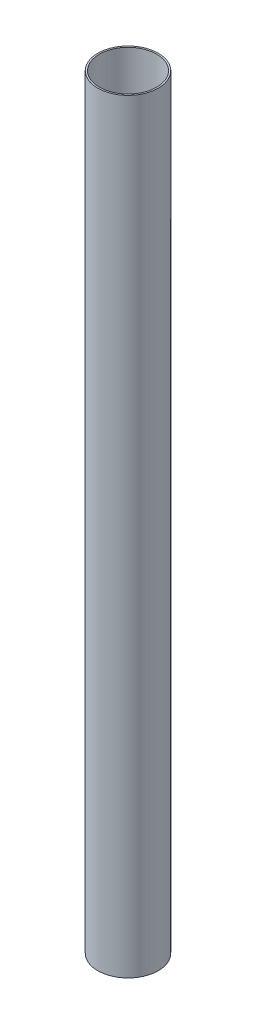
ISO-10303-21;
HEADER;
FILE_DESCRIPTION(('STEP AP214'),'2;1');
FILE_NAME('part.step','',(''),(''),'','','');
FILE_SCHEMA(('AUTOMOTIVE_DESIGN { 1 0 10303 214 1 1 1 1 }'));
ENDSEC;
DATA;
#1=APPLICATION_CONTEXT('core data for automotive mechanical design processes');
#2=APPLICATION_PROTOCOL_DEFINITION('international standard','automotive_design',2000,#1);
#3=PRODUCT_CONTEXT('',#1,'mechanical');
#4=PRODUCT('Part','Part','',(#3));
#5=PRODUCT_RELATED_PRODUCT_CATEGORY('part','',(#4));
#6=PRODUCT_DEFINITION_FORMATION('','',#4);
#7=PRODUCT_DEFINITION_CONTEXT('part definition',#1,'design');
#8=PRODUCT_DEFINITION('design','',#6,#7);
#9=PRODUCT_DEFINITION_SHAPE('','',#8);
#10=(LENGTH_UNIT() NAMED_UNIT(*) SI_UNIT(.MILLI.,.METRE.));
#11=(NAMED_UNIT(*) PLANE_ANGLE_UNIT() SI_UNIT($,.RADIAN.));
#12=(NAMED_UNIT(*) SI_UNIT($,.STERADIAN.) SOLID_ANGLE_UNIT());
#13=UNCERTAINTY_MEASURE_WITH_UNIT(LENGTH_MEASURE(1.E-05),#10,'distance_accuracy_value','');
#14=(GEOMETRIC_REPRESENTATION_CONTEXT(3) GLOBAL_UNCERTAINTY_ASSIGNED_CONTEXT((#13)) GLOBAL_UNIT_ASSIGNED_CONTEXT((#10,
#11,#12)) REPRESENTATION_CONTEXT('',''));
#15=CARTESIAN_POINT('',(0.,0.,0.));
#16=DIRECTION('',(0.,0.,1.));
#17=DIRECTION('',(1.,0.,0.));
#18=AXIS2_PLACEMENT_3D('',#15,#16,#17);
#19=CARTESIAN_POINT('',(0.,1219.2,0.));
#20=DIRECTION('',(0.,1.,0.));
#21=DIRECTION('',(0.,0.,1.));
#22=AXIS2_PLACEMENT_3D('',#19,#20,#21);
#23=PLANE('',#22);
#24=CARTESIAN_POINT('',(0.,1219.2,0.));
#25=DIRECTION('',(0.,1.,0.));
#26=DIRECTION('',(0.,0.,1.));
#27=AXIS2_PLACEMENT_3D('',#24,#25,#26);
#28=CIRCLE('',#27,48.26);
#29=CARTESIAN_POINT('',(0.,1219.2,-48.26));
#30=VERTEX_POINT('',#29);
#31=EDGE_CURVE('E10',#30,#30,#28,.T.);
#32=ORIENTED_EDGE('',*,*,#31,.T.);
#33=EDGE_LOOP('',(#32));
#34=FACE_BOUND('',#33,.T.);
#35=CARTESIAN_POINT('',(0.,1219.2,0.));
#36=DIRECTION('',(0.,1.,0.));
#37=DIRECTION('',(0.,0.,1.));
#38=AXIS2_PLACEMENT_3D('',#35,#36,#37);
#39=CIRCLE('',#38,45.72);
#40=CARTESIAN_POINT('',(0.,1219.2,-45.72));
#41=VERTEX_POINT('',#40);
#42=EDGE_CURVE('E47',#41,#41,#39,.T.);
#43=ORIENTED_EDGE('',*,*,#42,.F.);
#44=EDGE_LOOP('',(#43));
#45=FACE_BOUND('',#44,.T.);
#46=ADVANCED_FACE('F35',(#34,#45),#23,.T.);
#47=CARTESIAN_POINT('',(0.,0.,0.));
#48=DIRECTION('',(0.,1.,0.));
#49=DIRECTION('',(0.,0.,1.));
#50=AXIS2_PLACEMENT_3D('',#47,#48,#49);
#51=PLANE('',#50);
#52=CARTESIAN_POINT('',(0.,0.,0.));
#53=DIRECTION('',(0.,1.,0.));
#54=DIRECTION('',(0.,0.,1.));
#55=AXIS2_PLACEMENT_3D('',#52,#53,#54);
#56=CIRCLE('',#55,48.26);
#57=CARTESIAN_POINT('',(0.,0.,-48.26));
#58=VERTEX_POINT('',#57);
#59=EDGE_CURVE('E39',#58,#58,#56,.T.);
#60=ORIENTED_EDGE('',*,*,#59,.F.);
#61=EDGE_LOOP('',(#60));
#62=FACE_BOUND('',#61,.T.);
#63=CARTESIAN_POINT('',(0.,0.,0.));
#64=DIRECTION('',(0.,1.,0.));
#65=DIRECTION('',(0.,0.,1.));
#66=AXIS2_PLACEMENT_3D('',#63,#64,#65);
#67=CIRCLE('',#66,45.72);
#68=CARTESIAN_POINT('',(0.,0.,-45.72));
#69=VERTEX_POINT('',#68);
#70=EDGE_CURVE('E49',#69,#69,#67,.T.);
#71=ORIENTED_EDGE('',*,*,#70,.T.);
#72=EDGE_LOOP('',(#71));
#73=FACE_BOUND('',#72,.T.);
#74=ADVANCED_FACE('F60',(#62,#73),#51,.F.);
#75=CARTESIAN_POINT('',(0.,1219.2,0.));
#76=DIRECTION('',(0.,-1.,0.));
#77=DIRECTION('',(0.,0.,-1.));
#78=AXIS2_PLACEMENT_3D('',#75,#76,#77);
#79=CYLINDRICAL_SURFACE('',#78,48.26);
#80=CARTESIAN_POINT('',(0.,1219.2,-48.26));
#81=CARTESIAN_POINT('',(0.,1206.5,-48.26));
#82=CARTESIAN_POINT('',(0.,1193.8,-48.26));
#83=CARTESIAN_POINT('',(0.,1168.4,-48.26));
#84=CARTESIAN_POINT('',(0.,1155.7,-48.26));
#85=CARTESIAN_POINT('',(0.,1130.3,-48.26));
#86=CARTESIAN_POINT('',(0.,1117.6,-48.26));
#87=CARTESIAN_POINT('',(0.,1092.2,-48.26));
#88=CARTESIAN_POINT('',(0.,1079.5,-48.26));
#89=CARTESIAN_POINT('',(0.,1054.1,-48.26));
#90=CARTESIAN_POINT('',(0.,1041.4,-48.26));
#91=CARTESIAN_POINT('',(0.,1016.,-48.26));
#92=CARTESIAN_POINT('',(0.,1003.3,-48.26));
#93=CARTESIAN_POINT('',(0.,977.9,-48.26));
#94=CARTESIAN_POINT('',(0.,965.2,-48.26));
#95=CARTESIAN_POINT('',(0.,939.8,-48.26));
#96=CARTESIAN_POINT('',(0.,927.1,-48.26));
#97=CARTESIAN_POINT('',(0.,901.7,-48.26));
#98=CARTESIAN_POINT('',(0.,889.,-48.26));
#99=CARTESIAN_POINT('',(0.,863.6,-48.26));
#100=CARTESIAN_POINT('',(0.,850.9,-48.26));
#101=CARTESIAN_POINT('',(0.,825.5,-48.26));
#102=CARTESIAN_POINT('',(0.,812.8,-48.26));
#103=CARTESIAN_POINT('',(0.,787.4,-48.26));
#104=CARTESIAN_POINT('',(0.,774.7,-48.26));
#105=CARTESIAN_POINT('',(0.,749.3,-48.26));
#106=CARTESIAN_POINT('',(0.,736.6,-48.26));
#107=CARTESIAN_POINT('',(0.,711.2,-48.26));
#108=CARTESIAN_POINT('',(0.,698.5,-48.26));
#109=CARTESIAN_POINT('',(0.,673.1,-48.26));
#110=CARTESIAN_POINT('',(0.,660.4,-48.26));
#111=CARTESIAN_POINT('',(0.,635.,-48.26));
#112=CARTESIAN_POINT('',(0.,622.3,-48.26));
#113=CARTESIAN_POINT('',(0.,596.9,-48.26));
#114=CARTESIAN_POINT('',(0.,584.2,-48.26));
#115=CARTESIAN_POINT('',(0.,558.8,-48.26));
#116=CARTESIAN_POINT('',(0.,546.1,-48.26));
#117=CARTESIAN_POINT('',(0.,520.7,-48.26));
#118=CARTESIAN_POINT('',(0.,508.,-48.26));
#119=CARTESIAN_POINT('',(0.,482.6,-48.26));
#120=CARTESIAN_POINT('',(0.,469.9,-48.26));
#121=CARTESIAN_POINT('',(0.,444.5,-48.26));
#122=CARTESIAN_POINT('',(0.,431.8,-48.26));
#123=CARTESIAN_POINT('',(0.,406.4,-48.26));
#124=CARTESIAN_POINT('',(0.,393.7,-48.26));
#125=CARTESIAN_POINT('',(0.,368.3,-48.26));
#126=CARTESIAN_POINT('',(0.,355.6,-48.26));
#127=CARTESIAN_POINT('',(0.,330.2,-48.26));
#128=CARTESIAN_POINT('',(0.,317.5,-48.26));
#129=CARTESIAN_POINT('',(0.,292.1,-48.26));
#130=CARTESIAN_POINT('',(0.,279.4,-48.26));
#131=CARTESIAN_POINT('',(0.,254.,-48.26));
#132=CARTESIAN_POINT('',(0.,241.3,-48.26));
#133=CARTESIAN_POINT('',(0.,215.9,-48.26));
#134=CARTESIAN_POINT('',(0.,203.2,-48.26));
#135=CARTESIAN_POINT('',(0.,177.8,-48.26));
#136=CARTESIAN_POINT('',(0.,165.1,-48.26));
#137=CARTESIAN_POINT('',(0.,139.7,-48.26));
#138=CARTESIAN_POINT('',(0.,127.,-48.26));
#139=CARTESIAN_POINT('',(0.,101.6,-48.26));
#140=CARTESIAN_POINT('',(0.,88.9,-48.26));
#141=CARTESIAN_POINT('',(0.,63.5,-48.26));
#142=CARTESIAN_POINT('',(0.,50.8,-48.26));
#143=CARTESIAN_POINT('',(0.,25.4,-48.26));
#144=CARTESIAN_POINT('',(0.,12.7,-48.26));
#145=CARTESIAN_POINT('',(0.,0.,-48.26));
#146=B_SPLINE_CURVE_WITH_KNOTS('',3,(#80,#81,#82,#83,#84,#85,#86,#87,#88,#89,#90,#91,#92,#93,
#94,#95,#96,#97,#98,#99,#100,#101,#102,#103,#104,#105,#106,#107,#108,#109,#110,#111,#112,#113,
#114,#115,#116,#117,#118,#119,#120,#121,#122,#123,#124,#125,#126,#127,#128,#129,#130,#131,#132,
#133,#134,#135,#136,#137,#138,#139,#140,#141,#142,#143,#144,#145),.UNSPECIFIED.,.F.,.F.,(4,2,2,
2,2,2,2,2,2,2,2,2,2,2,2,2,2,2,2,2,2,2,2,2,2,2,2,2,2,2,2,2,4),(0.,38.1,76.2,114.3,152.4,190.5,
228.6,266.7,304.8,342.9,381.,419.1,457.2,495.3,533.4,571.5,609.6,647.7,685.8,723.9,762.,800.1,
838.2,876.3,914.4,952.5,990.6,1028.7,1066.8,1104.9,1143.,1181.1,1219.2),.UNSPECIFIED.);
#147=EDGE_CURVE('BSEAM37',#30,#58,#146,.T.);
#148=ORIENTED_EDGE('',*,*,#31,.F.);
#149=ORIENTED_EDGE('',*,*,#59,.T.);
#150=ORIENTED_EDGE('',*,*,#147,.T.);
#151=ORIENTED_EDGE('',*,*,#147,.F.);
#152=EDGE_LOOP('',(#148,#150,#149,#151));
#153=FACE_BOUND('',#152,.T.);
#154=ADVANCED_FACE('F37',(#153),#79,.T.);
#155=CARTESIAN_POINT('',(0.,1219.2,0.));
#156=DIRECTION('',(0.,-1.,0.));
#157=DIRECTION('',(0.,0.,-1.));
#158=AXIS2_PLACEMENT_3D('',#155,#156,#157);
#159=CYLINDRICAL_SURFACE('',#158,45.72);
#160=CARTESIAN_POINT('',(0.,1219.2,-45.72));
#161=CARTESIAN_POINT('',(0.,1206.5,-45.72));
#162=CARTESIAN_POINT('',(0.,1193.8,-45.72));
#163=CARTESIAN_POINT('',(0.,1168.4,-45.72));
#164=CARTESIAN_POINT('',(0.,1155.7,-45.72));
#165=CARTESIAN_POINT('',(0.,1130.3,-45.72));
#166=CARTESIAN_POINT('',(0.,1117.6,-45.72));
#167=CARTESIAN_POINT('',(0.,1092.2,-45.72));
#168=CARTESIAN_POINT('',(0.,1079.5,-45.72));
#169=CARTESIAN_POINT('',(0.,1054.1,-45.72));
#170=CARTESIAN_POINT('',(0.,1041.4,-45.72));
#171=CARTESIAN_POINT('',(0.,1016.,-45.72));
#172=CARTESIAN_POINT('',(0.,1003.3,-45.72));
#173=CARTESIAN_POINT('',(0.,977.9,-45.72));
#174=CARTESIAN_POINT('',(0.,965.2,-45.72));
#175=CARTESIAN_POINT('',(0.,939.8,-45.72));
#176=CARTESIAN_POINT('',(0.,927.1,-45.72));
#177=CARTESIAN_POINT('',(0.,901.7,-45.72));
#178=CARTESIAN_POINT('',(0.,889.,-45.72));
#179=CARTESIAN_POINT('',(0.,863.6,-45.72));
#180=CARTESIAN_POINT('',(0.,850.9,-45.72));
#181=CARTESIAN_POINT('',(0.,825.5,-45.72));
#182=CARTESIAN_POINT('',(0.,812.8,-45.72));
#183=CARTESIAN_POINT('',(0.,787.4,-45.72));
#184=CARTESIAN_POINT('',(0.,774.7,-45.72));
#185=CARTESIAN_POINT('',(0.,749.3,-45.72));
#186=CARTESIAN_POINT('',(0.,736.6,-45.72));
#187=CARTESIAN_POINT('',(0.,711.2,-45.72));
#188=CARTESIAN_POINT('',(0.,698.5,-45.72));
#189=CARTESIAN_POINT('',(0.,673.1,-45.72));
#190=CARTESIAN_POINT('',(0.,660.4,-45.72));
#191=CARTESIAN_POINT('',(0.,635.,-45.72));
#192=CARTESIAN_POINT('',(0.,622.3,-45.72));
#193=CARTESIAN_POINT('',(0.,596.9,-45.72));
#194=CARTESIAN_POINT('',(0.,584.2,-45.72));
#195=CARTESIAN_POINT('',(0.,558.8,-45.72));
#196=CARTESIAN_POINT('',(0.,546.1,-45.72));
#197=CARTESIAN_POINT('',(0.,520.7,-45.72));
#198=CARTESIAN_POINT('',(0.,508.,-45.72));
#199=CARTESIAN_POINT('',(0.,482.6,-45.72));
#200=CARTESIAN_POINT('',(0.,469.9,-45.72));
#201=CARTESIAN_POINT('',(0.,444.5,-45.72));
#202=CARTESIAN_POINT('',(0.,431.8,-45.72));
#203=CARTESIAN_POINT('',(0.,406.4,-45.72));
#204=CARTESIAN_POINT('',(0.,393.7,-45.72));
#205=CARTESIAN_POINT('',(0.,368.3,-45.72));
#206=CARTESIAN_POINT('',(0.,355.6,-45.72));
#207=CARTESIAN_POINT('',(0.,330.2,-45.72));
#208=CARTESIAN_POINT('',(0.,317.5,-45.72));
#209=CARTESIAN_POINT('',(0.,292.1,-45.72));
#210=CARTESIAN_POINT('',(0.,279.4,-45.72));
#211=CARTESIAN_POINT('',(0.,254.,-45.72));
#212=CARTESIAN_POINT('',(0.,241.3,-45.72));
#213=CARTESIAN_POINT('',(0.,215.9,-45.72));
#214=CARTESIAN_POINT('',(0.,203.2,-45.72));
#215=CARTESIAN_POINT('',(0.,177.8,-45.72));
#216=CARTESIAN_POINT('',(0.,165.1,-45.72));
#217=CARTESIAN_POINT('',(0.,139.7,-45.72));
#218=CARTESIAN_POINT('',(0.,127.,-45.72));
#219=CARTESIAN_POINT('',(0.,101.6,-45.72));
#220=CARTESIAN_POINT('',(0.,88.9,-45.72));
#221=CARTESIAN_POINT('',(0.,63.5,-45.72));
#222=CARTESIAN_POINT('',(0.,50.8,-45.72));
#223=CARTESIAN_POINT('',(0.,25.4,-45.72));
#224=CARTESIAN_POINT('',(0.,12.7,-45.72));
#225=CARTESIAN_POINT('',(0.,0.,-45.72));
#226=B_SPLINE_CURVE_WITH_KNOTS('',3,(#160,#161,#162,#163,#164,#165,#166,#167,#168,#169,#170,
#171,#172,#173,#174,#175,#176,#177,#178,#179,#180,#181,#182,#183,#184,#185,#186,#187,#188,#189,
#190,#191,#192,#193,#194,#195,#196,#197,#198,#199,#200,#201,#202,#203,#204,#205,#206,#207,#208,
#209,#210,#211,#212,#213,#214,#215,#216,#217,#218,#219,#220,#221,#222,#223,#224,#225),
.UNSPECIFIED.,.F.,.F.,(4,2,2,2,2,2,2,2,2,2,2,2,2,2,2,2,2,2,2,2,2,2,2,2,2,2,2,2,2,2,2,2,4),(0.,
38.1,76.2,114.3,152.4,190.5,228.6,266.7,304.8,342.9,381.,419.1,457.2,495.3,533.4,571.5,609.6,
647.7,685.8,723.9,762.,800.1,838.2,876.3,914.4,952.5,990.6,1028.7,1066.8,1104.9,1143.,1181.1,
1219.2),.UNSPECIFIED.);
#227=EDGE_CURVE('BSEAM56',#41,#69,#226,.T.);
#228=ORIENTED_EDGE('',*,*,#42,.T.);
#229=ORIENTED_EDGE('',*,*,#70,.F.);
#230=ORIENTED_EDGE('',*,*,#227,.T.);
#231=ORIENTED_EDGE('',*,*,#227,.F.);
#232=EDGE_LOOP('',(#228,#230,#229,#231));
#233=FACE_BOUND('',#232,.T.);
#234=ADVANCED_FACE('F56',(#233),#159,.F.);
#235=CLOSED_SHELL('',(#46,#74,#154,#234));
#236=MANIFOLD_SOLID_BREP('B2',#235);
#237=ADVANCED_BREP_SHAPE_REPRESENTATION('',(#18,#236),#14);
#238=SHAPE_DEFINITION_REPRESENTATION(#9,#237);
ENDSEC;
END-ISO-10303-21;
